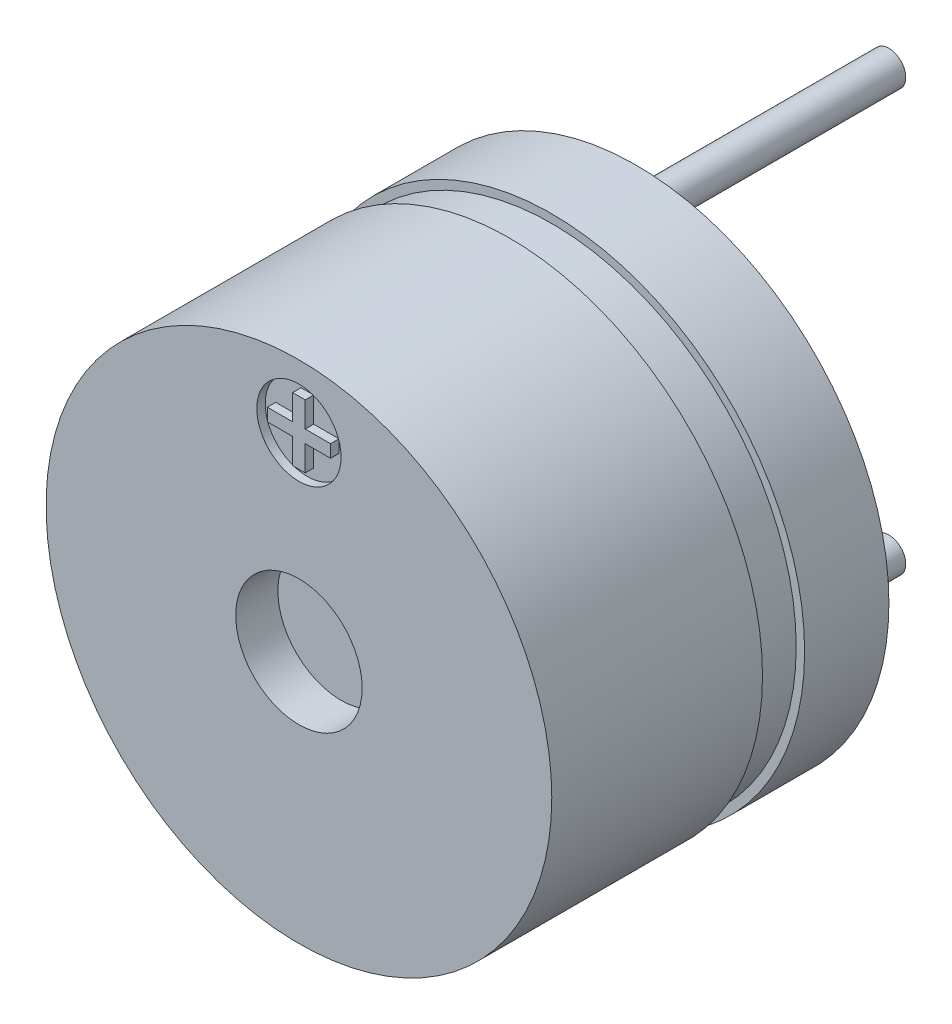
ISO-10303-21;
HEADER;
FILE_DESCRIPTION(('STEP AP214'),'2;1');
FILE_NAME('part.step','',(''),(''),'','','');
FILE_SCHEMA(('AUTOMOTIVE_DESIGN { 1 0 10303 214 1 1 1 1 }'));
ENDSEC;
DATA;
#1=APPLICATION_CONTEXT('core data for automotive mechanical design processes');
#2=APPLICATION_PROTOCOL_DEFINITION('international standard','automotive_design',2000,#1);
#3=PRODUCT_CONTEXT('',#1,'mechanical');
#4=PRODUCT('Part','Part','',(#3));
#5=PRODUCT_RELATED_PRODUCT_CATEGORY('part','',(#4));
#6=PRODUCT_DEFINITION_FORMATION('','',#4);
#7=PRODUCT_DEFINITION_CONTEXT('part definition',#1,'design');
#8=PRODUCT_DEFINITION('design','',#6,#7);
#9=PRODUCT_DEFINITION_SHAPE('','',#8);
#10=(LENGTH_UNIT() NAMED_UNIT(*) SI_UNIT(.MILLI.,.METRE.));
#11=(NAMED_UNIT(*) PLANE_ANGLE_UNIT() SI_UNIT($,.RADIAN.));
#12=(NAMED_UNIT(*) SI_UNIT($,.STERADIAN.) SOLID_ANGLE_UNIT());
#13=UNCERTAINTY_MEASURE_WITH_UNIT(LENGTH_MEASURE(1.E-05),#10,'distance_accuracy_value','');
#14=(GEOMETRIC_REPRESENTATION_CONTEXT(3) GLOBAL_UNCERTAINTY_ASSIGNED_CONTEXT((#13)) GLOBAL_UNIT_ASSIGNED_CONTEXT((#10,
#11,#12)) REPRESENTATION_CONTEXT('',''));
#15=CARTESIAN_POINT('',(0.,0.,0.));
#16=DIRECTION('',(0.,0.,1.));
#17=DIRECTION('',(1.,0.,0.));
#18=AXIS2_PLACEMENT_3D('',#15,#16,#17);
#19=CARTESIAN_POINT('',(0.,0.,0.));
#20=DIRECTION('',(0.,0.,-1.));
#21=DIRECTION('',(0.,-1.,0.));
#22=AXIS2_PLACEMENT_3D('',#19,#20,#21);
#23=PLANE('',#22);
#24=CARTESIAN_POINT('',(0.,0.,0.));
#25=DIRECTION('',(0.,0.,-1.));
#26=DIRECTION('',(1.,0.,0.));
#27=AXIS2_PLACEMENT_3D('',#24,#25,#26);
#28=CIRCLE('',#27,6.);
#29=CARTESIAN_POINT('',(6.,0.,0.));
#30=VERTEX_POINT('',#29);
#31=EDGE_CURVE('P0_E26',#30,#30,#28,.T.);
#32=ORIENTED_EDGE('',*,*,#31,.T.);
#33=EDGE_LOOP('',(#32));
#34=FACE_BOUND('',#33,.T.);
#35=ADVANCED_FACE('P0_F17',(#34),#23,.T.);
#36=CARTESIAN_POINT('',(0.,0.,1.));
#37=DIRECTION('',(0.,0.,-1.));
#38=DIRECTION('',(-1.,0.,0.));
#39=AXIS2_PLACEMENT_3D('',#36,#37,#38);
#40=CYLINDRICAL_SURFACE('',#39,6.);
#41=ORIENTED_EDGE('',*,*,#31,.F.);
#42=DIRECTION('',(0.,0.,1.));
#43=VECTOR('',#42,1.);
#44=CARTESIAN_POINT('',(6.,0.,1.));
#45=LINE('',#44,#43);
#46=CARTESIAN_POINT('',(6.,0.,2.));
#47=VERTEX_POINT('',#46);
#48=EDGE_CURVE('P0_E11',#30,#47,#45,.T.);
#49=ORIENTED_EDGE('',*,*,#48,.T.);
#50=CARTESIAN_POINT('',(0.,0.,2.));
#51=DIRECTION('',(0.,0.,-1.));
#52=DIRECTION('',(1.,0.,0.));
#53=AXIS2_PLACEMENT_3D('',#50,#51,#52);
#54=CIRCLE('',#53,6.);
#55=EDGE_CURVE('P0_E108',#47,#47,#54,.T.);
#56=ORIENTED_EDGE('',*,*,#55,.T.);
#57=ORIENTED_EDGE('',*,*,#48,.F.);
#58=EDGE_LOOP('',(#41,#49,#56,#57));
#59=FACE_BOUND('',#58,.T.);
#60=ADVANCED_FACE('P0_F126',(#59),#40,.T.);
#61=CARTESIAN_POINT('',(-6.,0.,2.));
#62=DIRECTION('',(0.,0.,1.));
#63=DIRECTION('',(1.,0.,0.));
#64=AXIS2_PLACEMENT_3D('',#61,#62,#63);
#65=PLANE('',#64);
#66=CARTESIAN_POINT('',(0.,0.,2.));
#67=DIRECTION('',(0.,0.,-1.));
#68=DIRECTION('',(1.,0.,0.));
#69=AXIS2_PLACEMENT_3D('',#66,#67,#68);
#70=CIRCLE('',#69,5.8);
#71=CARTESIAN_POINT('',(5.8,0.,2.));
#72=VERTEX_POINT('',#71);
#73=EDGE_CURVE('P0_E104',#72,#72,#70,.T.);
#74=ORIENTED_EDGE('',*,*,#73,.T.);
#75=EDGE_LOOP('',(#74));
#76=FACE_BOUND('',#75,.T.);
#77=ORIENTED_EDGE('',*,*,#55,.F.);
#78=EDGE_LOOP('',(#77));
#79=FACE_BOUND('',#78,.T.);
#80=ADVANCED_FACE('P0_F111',(#76,#79),#65,.T.);
#81=CARTESIAN_POINT('',(0.,0.,2.5));
#82=DIRECTION('',(0.,0.,-1.));
#83=DIRECTION('',(-1.,0.,0.));
#84=AXIS2_PLACEMENT_3D('',#81,#82,#83);
#85=CYLINDRICAL_SURFACE('',#84,5.8);
#86=ORIENTED_EDGE('',*,*,#73,.F.);
#87=DIRECTION('',(0.,0.,1.));
#88=VECTOR('',#87,1.);
#89=CARTESIAN_POINT('',(5.8,0.,2.5));
#90=LINE('',#89,#88);
#91=CARTESIAN_POINT('',(5.8,0.,3.));
#92=VERTEX_POINT('',#91);
#93=EDGE_CURVE('P0_E101',#72,#92,#90,.T.);
#94=ORIENTED_EDGE('',*,*,#93,.T.);
#95=CARTESIAN_POINT('',(0.,0.,3.));
#96=DIRECTION('',(0.,0.,-1.));
#97=DIRECTION('',(1.,0.,0.));
#98=AXIS2_PLACEMENT_3D('',#95,#96,#97);
#99=CIRCLE('',#98,5.8);
#100=EDGE_CURVE('P0_E106',#92,#92,#99,.T.);
#101=ORIENTED_EDGE('',*,*,#100,.T.);
#102=ORIENTED_EDGE('',*,*,#93,.F.);
#103=EDGE_LOOP('',(#86,#94,#101,#102));
#104=FACE_BOUND('',#103,.T.);
#105=ADVANCED_FACE('P0_F103',(#104),#85,.T.);
#106=CARTESIAN_POINT('',(-5.8,0.,3.));
#107=DIRECTION('',(0.,0.,-1.));
#108=DIRECTION('',(0.,-1.,0.));
#109=AXIS2_PLACEMENT_3D('',#106,#107,#108);
#110=PLANE('',#109);
#111=ORIENTED_EDGE('',*,*,#100,.F.);
#112=EDGE_LOOP('',(#111));
#113=FACE_BOUND('',#112,.T.);
#114=CARTESIAN_POINT('',(0.,0.,3.));
#115=DIRECTION('',(0.,0.,-1.));
#116=DIRECTION('',(1.,0.,0.));
#117=AXIS2_PLACEMENT_3D('',#114,#115,#116);
#118=CIRCLE('',#117,6.);
#119=CARTESIAN_POINT('',(6.,0.,3.));
#120=VERTEX_POINT('',#119);
#121=EDGE_CURVE('P0_E415',#120,#120,#118,.T.);
#122=ORIENTED_EDGE('',*,*,#121,.T.);
#123=EDGE_LOOP('',(#122));
#124=FACE_BOUND('',#123,.T.);
#125=ADVANCED_FACE('P0_F135',(#113,#124),#110,.T.);
#126=CARTESIAN_POINT('',(0.,0.,5.5));
#127=DIRECTION('',(0.,0.,-1.));
#128=DIRECTION('',(-1.,0.,0.));
#129=AXIS2_PLACEMENT_3D('',#126,#127,#128);
#130=CYLINDRICAL_SURFACE('',#129,6.);
#131=ORIENTED_EDGE('',*,*,#121,.F.);
#132=DIRECTION('',(0.,0.,1.));
#133=VECTOR('',#132,1.);
#134=CARTESIAN_POINT('',(6.,0.,5.5));
#135=LINE('',#134,#133);
#136=CARTESIAN_POINT('',(6.,0.,8.));
#137=VERTEX_POINT('',#136);
#138=EDGE_CURVE('P0_E118',#120,#137,#135,.T.);
#139=ORIENTED_EDGE('',*,*,#138,.T.);
#140=CARTESIAN_POINT('',(0.,0.,8.));
#141=DIRECTION('',(0.,0.,-1.));
#142=DIRECTION('',(1.,0.,0.));
#143=AXIS2_PLACEMENT_3D('',#140,#141,#142);
#144=CIRCLE('',#143,6.);
#145=EDGE_CURVE('P0_E449',#137,#137,#144,.T.);
#146=ORIENTED_EDGE('',*,*,#145,.T.);
#147=ORIENTED_EDGE('',*,*,#138,.F.);
#148=EDGE_LOOP('',(#131,#139,#146,#147));
#149=FACE_BOUND('',#148,.T.);
#150=ADVANCED_FACE('P0_F173',(#149),#130,.T.);
#151=CARTESIAN_POINT('',(-6.,0.,8.));
#152=DIRECTION('',(0.,0.,1.));
#153=DIRECTION('',(1.,0.,0.));
#154=AXIS2_PLACEMENT_3D('',#151,#152,#153);
#155=PLANE('',#154);
#156=DIRECTION('',(0.,1.,0.));
#157=VECTOR('',#156,1.);
#158=CARTESIAN_POINT('',(0.75,2.175,8.));
#159=LINE('',#158,#157);
#160=CARTESIAN_POINT('',(0.75,4.35,8.));
#161=VERTEX_POINT('',#160);
#162=CARTESIAN_POINT('',(0.75,4.65,8.));
#163=VERTEX_POINT('',#162);
#164=EDGE_CURVE('P0_E746',#161,#163,#159,.T.);
#165=ORIENTED_EDGE('',*,*,#164,.T.);
#166=DIRECTION('',(-1.,0.,0.));
#167=VECTOR('',#166,1.);
#168=CARTESIAN_POINT('',(-2.625,4.65,8.));
#169=LINE('',#168,#167);
#170=CARTESIAN_POINT('',(0.15,4.65,8.));
#171=VERTEX_POINT('',#170);
#172=EDGE_CURVE('P0_E471',#163,#171,#169,.T.);
#173=ORIENTED_EDGE('',*,*,#172,.T.);
#174=DIRECTION('',(0.,1.,0.));
#175=VECTOR('',#174,1.);
#176=CARTESIAN_POINT('',(0.15,2.325,8.));
#177=LINE('',#176,#175);
#178=CARTESIAN_POINT('',(0.15,5.25,8.));
#179=VERTEX_POINT('',#178);
#180=EDGE_CURVE('P0_E491',#171,#179,#177,.T.);
#181=ORIENTED_EDGE('',*,*,#180,.T.);
#182=DIRECTION('',(-1.,0.,0.));
#183=VECTOR('',#182,1.);
#184=CARTESIAN_POINT('',(-2.925,5.25,8.));
#185=LINE('',#184,#183);
#186=CARTESIAN_POINT('',(-0.15,5.25,8.));
#187=VERTEX_POINT('',#186);
#188=EDGE_CURVE('P0_E513',#179,#187,#185,.T.);
#189=ORIENTED_EDGE('',*,*,#188,.T.);
#190=DIRECTION('',(0.,-1.,0.));
#191=VECTOR('',#190,1.);
#192=CARTESIAN_POINT('',(-0.15,2.625,8.));
#193=LINE('',#192,#191);
#194=CARTESIAN_POINT('',(-0.15,4.65,8.));
#195=VERTEX_POINT('',#194);
#196=EDGE_CURVE('P0_E537',#187,#195,#193,.T.);
#197=ORIENTED_EDGE('',*,*,#196,.T.);
#198=DIRECTION('',(-1.,0.,0.));
#199=VECTOR('',#198,1.);
#200=CARTESIAN_POINT('',(-3.075,4.65,8.));
#201=LINE('',#200,#199);
#202=CARTESIAN_POINT('',(-0.75,4.65,8.));
#203=VERTEX_POINT('',#202);
#204=EDGE_CURVE('P0_E559',#195,#203,#201,.T.);
#205=ORIENTED_EDGE('',*,*,#204,.T.);
#206=DIRECTION('',(0.,-1.,0.));
#207=VECTOR('',#206,1.);
#208=CARTESIAN_POINT('',(-0.75,2.325,8.));
#209=LINE('',#208,#207);
#210=CARTESIAN_POINT('',(-0.75,4.35,8.));
#211=VERTEX_POINT('',#210);
#212=EDGE_CURVE('P0_E583',#203,#211,#209,.T.);
#213=ORIENTED_EDGE('',*,*,#212,.T.);
#214=DIRECTION('',(1.,0.,0.));
#215=VECTOR('',#214,1.);
#216=CARTESIAN_POINT('',(-3.375,4.35,8.));
#217=LINE('',#216,#215);
#218=CARTESIAN_POINT('',(-0.15,4.35,8.));
#219=VERTEX_POINT('',#218);
#220=EDGE_CURVE('P0_E608',#211,#219,#217,.T.);
#221=ORIENTED_EDGE('',*,*,#220,.T.);
#222=DIRECTION('',(0.,-1.,0.));
#223=VECTOR('',#222,1.);
#224=CARTESIAN_POINT('',(-0.15,2.175,8.));
#225=LINE('',#224,#223);
#226=CARTESIAN_POINT('',(-0.15,3.75,8.));
#227=VERTEX_POINT('',#226);
#228=EDGE_CURVE('P0_E646',#219,#227,#225,.T.);
#229=ORIENTED_EDGE('',*,*,#228,.T.);
#230=DIRECTION('',(1.,0.,0.));
#231=VECTOR('',#230,1.);
#232=CARTESIAN_POINT('',(-3.075,3.75,8.));
#233=LINE('',#232,#231);
#234=CARTESIAN_POINT('',(0.15,3.75,8.));
#235=VERTEX_POINT('',#234);
#236=EDGE_CURVE('P0_E625',#227,#235,#233,.T.);
#237=ORIENTED_EDGE('',*,*,#236,.T.);
#238=DIRECTION('',(0.,1.,0.));
#239=VECTOR('',#238,1.);
#240=CARTESIAN_POINT('',(0.15,1.875,8.));
#241=LINE('',#240,#239);
#242=CARTESIAN_POINT('',(0.15,4.35,8.));
#243=VERTEX_POINT('',#242);
#244=EDGE_CURVE('P0_E666',#235,#243,#241,.T.);
#245=ORIENTED_EDGE('',*,*,#244,.T.);
#246=DIRECTION('',(1.,0.,0.));
#247=VECTOR('',#246,1.);
#248=CARTESIAN_POINT('',(-2.925,4.35,8.));
#249=LINE('',#248,#247);
#250=EDGE_CURVE('P0_E708',#243,#161,#249,.T.);
#251=ORIENTED_EDGE('',*,*,#250,.T.);
#252=EDGE_LOOP('',(#165,#173,#181,#189,#197,#205,#213,#221,#229,#237,#245,#251));
#253=FACE_BOUND('',#252,.T.);
#254=ADVANCED_FACE('P0_F184',(#253),#155,.T.);
#255=CARTESIAN_POINT('',(0.,0.,7.));
#256=DIRECTION('',(0.,0.,1.));
#257=DIRECTION('',(1.,0.,0.));
#258=AXIS2_PLACEMENT_3D('',#255,#256,#257);
#259=PLANE('',#258);
#260=CARTESIAN_POINT('',(0.,0.,7.));
#261=DIRECTION('',(0.,0.,-1.));
#262=DIRECTION('',(-1.,0.,0.));
#263=AXIS2_PLACEMENT_3D('',#260,#261,#262);
#264=CIRCLE('',#263,1.5);
#265=CARTESIAN_POINT('',(1.5,0.,7.));
#266=VERTEX_POINT('',#265);
#267=EDGE_CURVE('P0_E421',#266,#266,#264,.T.);
#268=ORIENTED_EDGE('',*,*,#267,.F.);
#269=EDGE_LOOP('',(#268));
#270=FACE_BOUND('',#269,.T.);
#271=ADVANCED_FACE('P0_F195',(#270),#259,.T.);
#272=CARTESIAN_POINT('',(0.,0.,8.));
#273=DIRECTION('',(0.,0.,-1.));
#274=DIRECTION('',(-1.,0.,0.));
#275=AXIS2_PLACEMENT_3D('',#272,#273,#274);
#276=CYLINDRICAL_SURFACE('',#275,1.5);
#277=CARTESIAN_POINT('',(0.,0.,8.));
#278=DIRECTION('',(0.,0.,-1.));
#279=DIRECTION('',(-1.,0.,0.));
#280=AXIS2_PLACEMENT_3D('',#277,#278,#279);
#281=CIRCLE('',#280,1.5);
#282=CARTESIAN_POINT('',(1.5,0.,8.));
#283=VERTEX_POINT('',#282);
#284=EDGE_CURVE('P0_E440',#283,#283,#281,.T.);
#285=ORIENTED_EDGE('',*,*,#284,.F.);
#286=DIRECTION('',(0.,0.,-1.));
#287=VECTOR('',#286,1.);
#288=CARTESIAN_POINT('',(1.5,0.,8.));
#289=LINE('',#288,#287);
#290=EDGE_CURVE('P0_E432',#283,#266,#289,.T.);
#291=ORIENTED_EDGE('',*,*,#290,.T.);
#292=ORIENTED_EDGE('',*,*,#267,.T.);
#293=ORIENTED_EDGE('',*,*,#290,.F.);
#294=EDGE_LOOP('',(#285,#291,#292,#293));
#295=FACE_BOUND('',#294,.T.);
#296=ADVANCED_FACE('P0_F206',(#295),#276,.F.);
#297=CARTESIAN_POINT('',(-6.,0.,8.));
#298=DIRECTION('',(0.,0.,1.));
#299=DIRECTION('',(1.,0.,0.));
#300=AXIS2_PLACEMENT_3D('',#297,#298,#299);
#301=PLANE('',#300);
#302=CARTESIAN_POINT('',(0.,4.5,8.));
#303=DIRECTION('',(0.,0.,-1.));
#304=DIRECTION('',(-1.,0.,0.));
#305=AXIS2_PLACEMENT_3D('',#302,#303,#304);
#306=CIRCLE('',#305,1.);
#307=CARTESIAN_POINT('',(1.,4.5,8.));
#308=VERTEX_POINT('',#307);
#309=EDGE_CURVE('P0_E459',#308,#308,#306,.T.);
#310=ORIENTED_EDGE('',*,*,#309,.T.);
#311=EDGE_LOOP('',(#310));
#312=FACE_BOUND('',#311,.T.);
#313=ORIENTED_EDGE('',*,*,#284,.T.);
#314=EDGE_LOOP('',(#313));
#315=FACE_BOUND('',#314,.T.);
#316=ORIENTED_EDGE('',*,*,#145,.F.);
#317=EDGE_LOOP('',(#316));
#318=FACE_BOUND('',#317,.T.);
#319=ADVANCED_FACE('P0_F218',(#312,#315,#318),#301,.T.);
#320=CARTESIAN_POINT('',(0.,4.5,7.8));
#321=DIRECTION('',(0.,0.,1.));
#322=DIRECTION('',(1.,0.,0.));
#323=AXIS2_PLACEMENT_3D('',#320,#321,#322);
#324=PLANE('',#323);
#325=DIRECTION('',(-1.,0.,0.));
#326=VECTOR('',#325,1.);
#327=CARTESIAN_POINT('',(-0.75,4.65,7.8));
#328=LINE('',#327,#326);
#329=CARTESIAN_POINT('',(0.75,4.65,7.8));
#330=VERTEX_POINT('',#329);
#331=CARTESIAN_POINT('',(0.15,4.65,7.8));
#332=VERTEX_POINT('',#331);
#333=EDGE_CURVE('P0_E467',#330,#332,#328,.T.);
#334=ORIENTED_EDGE('',*,*,#333,.F.);
#335=DIRECTION('',(0.,1.,0.));
#336=VECTOR('',#335,1.);
#337=CARTESIAN_POINT('',(0.75,4.65,7.8));
#338=LINE('',#337,#336);
#339=CARTESIAN_POINT('',(0.75,4.35,7.8));
#340=VERTEX_POINT('',#339);
#341=EDGE_CURVE('P0_E730',#340,#330,#338,.T.);
#342=ORIENTED_EDGE('',*,*,#341,.F.);
#343=DIRECTION('',(1.,0.,0.));
#344=VECTOR('',#343,1.);
#345=CARTESIAN_POINT('',(0.75,4.35,7.8));
#346=LINE('',#345,#344);
#347=CARTESIAN_POINT('',(0.15,4.35,7.8));
#348=VERTEX_POINT('',#347);
#349=EDGE_CURVE('P0_E680',#348,#340,#346,.T.);
#350=ORIENTED_EDGE('',*,*,#349,.F.);
#351=DIRECTION('',(0.,1.,0.));
#352=VECTOR('',#351,1.);
#353=CARTESIAN_POINT('',(0.15,5.25,7.8));
#354=LINE('',#353,#352);
#355=CARTESIAN_POINT('',(0.15,3.75,7.8));
#356=VERTEX_POINT('',#355);
#357=EDGE_CURVE('P0_E630',#356,#348,#354,.T.);
#358=ORIENTED_EDGE('',*,*,#357,.F.);
#359=DIRECTION('',(1.,0.,0.));
#360=VECTOR('',#359,1.);
#361=CARTESIAN_POINT('',(0.15,3.75,7.8));
#362=LINE('',#361,#360);
#363=CARTESIAN_POINT('',(-0.15,3.75,7.8));
#364=VERTEX_POINT('',#363);
#365=EDGE_CURVE('P0_E624',#364,#356,#362,.T.);
#366=ORIENTED_EDGE('',*,*,#365,.F.);
#367=DIRECTION('',(0.,-1.,0.));
#368=VECTOR('',#367,1.);
#369=CARTESIAN_POINT('',(-0.15,3.75,7.8));
#370=LINE('',#369,#368);
#371=CARTESIAN_POINT('',(-0.15,4.35,7.8));
#372=VERTEX_POINT('',#371);
#373=EDGE_CURVE('P0_E614',#372,#364,#370,.T.);
#374=ORIENTED_EDGE('',*,*,#373,.F.);
#375=DIRECTION('',(1.,0.,0.));
#376=VECTOR('',#375,1.);
#377=CARTESIAN_POINT('',(0.75,4.35,7.8));
#378=LINE('',#377,#376);
#379=CARTESIAN_POINT('',(-0.75,4.35,7.8));
#380=VERTEX_POINT('',#379);
#381=EDGE_CURVE('P0_E591',#380,#372,#378,.T.);
#382=ORIENTED_EDGE('',*,*,#381,.F.);
#383=DIRECTION('',(0.,-1.,0.));
#384=VECTOR('',#383,1.);
#385=CARTESIAN_POINT('',(-0.75,4.35,7.8));
#386=LINE('',#385,#384);
#387=CARTESIAN_POINT('',(-0.75,4.65,7.8));
#388=VERTEX_POINT('',#387);
#389=EDGE_CURVE('P0_E567',#388,#380,#386,.T.);
#390=ORIENTED_EDGE('',*,*,#389,.F.);
#391=DIRECTION('',(-1.,0.,0.));
#392=VECTOR('',#391,1.);
#393=CARTESIAN_POINT('',(-0.75,4.65,7.8));
#394=LINE('',#393,#392);
#395=CARTESIAN_POINT('',(-0.15,4.65,7.8));
#396=VERTEX_POINT('',#395);
#397=EDGE_CURVE('P0_E543',#396,#388,#394,.T.);
#398=ORIENTED_EDGE('',*,*,#397,.F.);
#399=DIRECTION('',(0.,-1.,0.));
#400=VECTOR('',#399,1.);
#401=CARTESIAN_POINT('',(-0.15,3.75,7.8));
#402=LINE('',#401,#400);
#403=CARTESIAN_POINT('',(-0.15,5.25,7.8));
#404=VERTEX_POINT('',#403);
#405=EDGE_CURVE('P0_E520',#404,#396,#402,.T.);
#406=ORIENTED_EDGE('',*,*,#405,.F.);
#407=DIRECTION('',(-1.,0.,0.));
#408=VECTOR('',#407,1.);
#409=CARTESIAN_POINT('',(-0.15,5.25,7.8));
#410=LINE('',#409,#408);
#411=CARTESIAN_POINT('',(0.15,5.25,7.8));
#412=VERTEX_POINT('',#411);
#413=EDGE_CURVE('P0_E498',#412,#404,#410,.T.);
#414=ORIENTED_EDGE('',*,*,#413,.F.);
#415=DIRECTION('',(0.,1.,0.));
#416=VECTOR('',#415,1.);
#417=CARTESIAN_POINT('',(0.15,5.25,7.8));
#418=LINE('',#417,#416);
#419=EDGE_CURVE('P0_E476',#332,#412,#418,.T.);
#420=ORIENTED_EDGE('',*,*,#419,.F.);
#421=EDGE_LOOP('',(#334,#342,#350,#358,#366,#374,#382,#390,#398,#406,#414,#420));
#422=FACE_BOUND('',#421,.T.);
#423=CARTESIAN_POINT('',(0.,4.5,7.8));
#424=DIRECTION('',(0.,0.,-1.));
#425=DIRECTION('',(-1.,0.,0.));
#426=AXIS2_PLACEMENT_3D('',#423,#424,#425);
#427=CIRCLE('',#426,1.);
#428=CARTESIAN_POINT('',(1.,4.5,7.8));
#429=VERTEX_POINT('',#428);
#430=EDGE_CURVE('P0_E444',#429,#429,#427,.T.);
#431=ORIENTED_EDGE('',*,*,#430,.F.);
#432=EDGE_LOOP('',(#431));
#433=FACE_BOUND('',#432,.T.);
#434=ADVANCED_FACE('P0_F231',(#422,#433),#324,.T.);
#435=CARTESIAN_POINT('',(0.,4.5,8.));
#436=DIRECTION('',(0.,0.,-1.));
#437=DIRECTION('',(-1.,0.,0.));
#438=AXIS2_PLACEMENT_3D('',#435,#436,#437);
#439=CYLINDRICAL_SURFACE('',#438,1.);
#440=ORIENTED_EDGE('',*,*,#309,.F.);
#441=DIRECTION('',(0.,0.,-1.));
#442=VECTOR('',#441,1.);
#443=CARTESIAN_POINT('',(1.,4.5,8.));
#444=LINE('',#443,#442);
#445=EDGE_CURVE('P0_E450',#308,#429,#444,.T.);
#446=ORIENTED_EDGE('',*,*,#445,.T.);
#447=ORIENTED_EDGE('',*,*,#430,.T.);
#448=ORIENTED_EDGE('',*,*,#445,.F.);
#449=EDGE_LOOP('',(#440,#446,#447,#448));
#450=FACE_BOUND('',#449,.T.);
#451=ADVANCED_FACE('P0_F242',(#450),#439,.F.);
#452=CARTESIAN_POINT('',(0.75,4.65,8.));
#453=DIRECTION('',(0.,-1.,0.));
#454=DIRECTION('',(0.,0.,-1.));
#455=AXIS2_PLACEMENT_3D('',#452,#453,#454);
#456=PLANE('',#455);
#457=ORIENTED_EDGE('',*,*,#172,.F.);
#458=DIRECTION('',(0.,0.,-1.));
#459=VECTOR('',#458,1.);
#460=CARTESIAN_POINT('',(0.75,4.65,8.));
#461=LINE('',#460,#459);
#462=EDGE_CURVE('P0_E724',#163,#330,#461,.T.);
#463=ORIENTED_EDGE('',*,*,#462,.T.);
#464=ORIENTED_EDGE('',*,*,#333,.T.);
#465=DIRECTION('',(0.,0.,-1.));
#466=VECTOR('',#465,1.);
#467=CARTESIAN_POINT('',(0.15,4.65,8.));
#468=LINE('',#467,#466);
#469=EDGE_CURVE('P0_E483',#171,#332,#468,.T.);
#470=ORIENTED_EDGE('',*,*,#469,.F.);
#471=EDGE_LOOP('',(#457,#463,#464,#470));
#472=FACE_BOUND('',#471,.T.);
#473=ADVANCED_FACE('P0_F253',(#472),#456,.F.);
#474=CARTESIAN_POINT('',(0.15,4.65,8.));
#475=DIRECTION('',(-1.,0.,0.));
#476=DIRECTION('',(0.,0.,1.));
#477=AXIS2_PLACEMENT_3D('',#474,#475,#476);
#478=PLANE('',#477);
#479=ORIENTED_EDGE('',*,*,#180,.F.);
#480=ORIENTED_EDGE('',*,*,#469,.T.);
#481=ORIENTED_EDGE('',*,*,#419,.T.);
#482=DIRECTION('',(0.,0.,-1.));
#483=VECTOR('',#482,1.);
#484=CARTESIAN_POINT('',(0.15,5.25,8.));
#485=LINE('',#484,#483);
#486=EDGE_CURVE('P0_E505',#179,#412,#485,.T.);
#487=ORIENTED_EDGE('',*,*,#486,.F.);
#488=EDGE_LOOP('',(#479,#480,#481,#487));
#489=FACE_BOUND('',#488,.T.);
#490=ADVANCED_FACE('P0_F265',(#489),#478,.F.);
#491=CARTESIAN_POINT('',(0.15,5.25,8.));
#492=DIRECTION('',(0.,-1.,0.));
#493=DIRECTION('',(0.,0.,-1.));
#494=AXIS2_PLACEMENT_3D('',#491,#492,#493);
#495=PLANE('',#494);
#496=ORIENTED_EDGE('',*,*,#188,.F.);
#497=ORIENTED_EDGE('',*,*,#486,.T.);
#498=ORIENTED_EDGE('',*,*,#413,.T.);
#499=DIRECTION('',(0.,0.,-1.));
#500=VECTOR('',#499,1.);
#501=CARTESIAN_POINT('',(-0.15,5.25,8.));
#502=LINE('',#501,#500);
#503=EDGE_CURVE('P0_E533',#187,#404,#502,.T.);
#504=ORIENTED_EDGE('',*,*,#503,.F.);
#505=EDGE_LOOP('',(#496,#497,#498,#504));
#506=FACE_BOUND('',#505,.T.);
#507=ADVANCED_FACE('P0_F276',(#506),#495,.F.);
#508=CARTESIAN_POINT('',(-0.15,5.25,8.));
#509=DIRECTION('',(1.,0.,0.));
#510=DIRECTION('',(0.,1.,0.));
#511=AXIS2_PLACEMENT_3D('',#508,#509,#510);
#512=PLANE('',#511);
#513=ORIENTED_EDGE('',*,*,#196,.F.);
#514=ORIENTED_EDGE('',*,*,#503,.T.);
#515=ORIENTED_EDGE('',*,*,#405,.T.);
#516=DIRECTION('',(0.,0.,-1.));
#517=VECTOR('',#516,1.);
#518=CARTESIAN_POINT('',(-0.15,4.65,8.));
#519=LINE('',#518,#517);
#520=EDGE_CURVE('P0_E551',#195,#396,#519,.T.);
#521=ORIENTED_EDGE('',*,*,#520,.F.);
#522=EDGE_LOOP('',(#513,#514,#515,#521));
#523=FACE_BOUND('',#522,.T.);
#524=ADVANCED_FACE('P0_F287',(#523),#512,.F.);
#525=CARTESIAN_POINT('',(-0.15,4.65,8.));
#526=DIRECTION('',(0.,-1.,0.));
#527=DIRECTION('',(0.,0.,-1.));
#528=AXIS2_PLACEMENT_3D('',#525,#526,#527);
#529=PLANE('',#528);
#530=ORIENTED_EDGE('',*,*,#204,.F.);
#531=ORIENTED_EDGE('',*,*,#520,.T.);
#532=ORIENTED_EDGE('',*,*,#397,.T.);
#533=DIRECTION('',(0.,0.,-1.));
#534=VECTOR('',#533,1.);
#535=CARTESIAN_POINT('',(-0.75,4.65,8.));
#536=LINE('',#535,#534);
#537=EDGE_CURVE('P0_E575',#203,#388,#536,.T.);
#538=ORIENTED_EDGE('',*,*,#537,.F.);
#539=EDGE_LOOP('',(#530,#531,#532,#538));
#540=FACE_BOUND('',#539,.T.);
#541=ADVANCED_FACE('P0_F298',(#540),#529,.F.);
#542=CARTESIAN_POINT('',(-0.75,4.65,8.));
#543=DIRECTION('',(1.,0.,0.));
#544=DIRECTION('',(0.,1.,0.));
#545=AXIS2_PLACEMENT_3D('',#542,#543,#544);
#546=PLANE('',#545);
#547=ORIENTED_EDGE('',*,*,#212,.F.);
#548=ORIENTED_EDGE('',*,*,#537,.T.);
#549=ORIENTED_EDGE('',*,*,#389,.T.);
#550=DIRECTION('',(0.,0.,-1.));
#551=VECTOR('',#550,1.);
#552=CARTESIAN_POINT('',(-0.75,4.35,8.));
#553=LINE('',#552,#551);
#554=EDGE_CURVE('P0_E599',#211,#380,#553,.T.);
#555=ORIENTED_EDGE('',*,*,#554,.F.);
#556=EDGE_LOOP('',(#547,#548,#549,#555));
#557=FACE_BOUND('',#556,.T.);
#558=ADVANCED_FACE('P0_F309',(#557),#546,.F.);
#559=CARTESIAN_POINT('',(-0.75,4.35,8.));
#560=DIRECTION('',(0.,1.,0.));
#561=DIRECTION('',(1.,0.,0.));
#562=AXIS2_PLACEMENT_3D('',#559,#560,#561);
#563=PLANE('',#562);
#564=ORIENTED_EDGE('',*,*,#220,.F.);
#565=ORIENTED_EDGE('',*,*,#554,.T.);
#566=ORIENTED_EDGE('',*,*,#381,.T.);
#567=DIRECTION('',(0.,0.,-1.));
#568=VECTOR('',#567,1.);
#569=CARTESIAN_POINT('',(-0.15,4.35,8.));
#570=LINE('',#569,#568);
#571=EDGE_CURVE('P0_E652',#219,#372,#570,.T.);
#572=ORIENTED_EDGE('',*,*,#571,.F.);
#573=EDGE_LOOP('',(#564,#565,#566,#572));
#574=FACE_BOUND('',#573,.T.);
#575=ADVANCED_FACE('P0_F320',(#574),#563,.F.);
#576=CARTESIAN_POINT('',(-0.15,4.35,8.));
#577=DIRECTION('',(1.,0.,0.));
#578=DIRECTION('',(0.,1.,0.));
#579=AXIS2_PLACEMENT_3D('',#576,#577,#578);
#580=PLANE('',#579);
#581=ORIENTED_EDGE('',*,*,#228,.F.);
#582=ORIENTED_EDGE('',*,*,#571,.T.);
#583=ORIENTED_EDGE('',*,*,#373,.T.);
#584=DIRECTION('',(0.,0.,-1.));
#585=VECTOR('',#584,1.);
#586=CARTESIAN_POINT('',(-0.15,3.75,8.));
#587=LINE('',#586,#585);
#588=EDGE_CURVE('P0_E618',#227,#364,#587,.T.);
#589=ORIENTED_EDGE('',*,*,#588,.F.);
#590=EDGE_LOOP('',(#581,#582,#583,#589));
#591=FACE_BOUND('',#590,.T.);
#592=ADVANCED_FACE('P0_F330',(#591),#580,.F.);
#593=CARTESIAN_POINT('',(-0.15,3.75,8.));
#594=DIRECTION('',(0.,1.,0.));
#595=DIRECTION('',(1.,0.,0.));
#596=AXIS2_PLACEMENT_3D('',#593,#594,#595);
#597=PLANE('',#596);
#598=ORIENTED_EDGE('',*,*,#236,.F.);
#599=ORIENTED_EDGE('',*,*,#588,.T.);
#600=ORIENTED_EDGE('',*,*,#365,.T.);
#601=DIRECTION('',(0.,0.,-1.));
#602=VECTOR('',#601,1.);
#603=CARTESIAN_POINT('',(0.15,3.75,8.));
#604=LINE('',#603,#602);
#605=EDGE_CURVE('P0_E636',#235,#356,#604,.T.);
#606=ORIENTED_EDGE('',*,*,#605,.F.);
#607=EDGE_LOOP('',(#598,#599,#600,#606));
#608=FACE_BOUND('',#607,.T.);
#609=ADVANCED_FACE('P0_F340',(#608),#597,.F.);
#610=CARTESIAN_POINT('',(0.15,3.75,8.));
#611=DIRECTION('',(-1.,0.,0.));
#612=DIRECTION('',(0.,0.,1.));
#613=AXIS2_PLACEMENT_3D('',#610,#611,#612);
#614=PLANE('',#613);
#615=ORIENTED_EDGE('',*,*,#244,.F.);
#616=ORIENTED_EDGE('',*,*,#605,.T.);
#617=ORIENTED_EDGE('',*,*,#357,.T.);
#618=DIRECTION('',(0.,0.,-1.));
#619=VECTOR('',#618,1.);
#620=CARTESIAN_POINT('',(0.15,4.35,8.));
#621=LINE('',#620,#619);
#622=EDGE_CURVE('P0_E694',#243,#348,#621,.T.);
#623=ORIENTED_EDGE('',*,*,#622,.F.);
#624=EDGE_LOOP('',(#615,#616,#617,#623));
#625=FACE_BOUND('',#624,.T.);
#626=ADVANCED_FACE('P0_F350',(#625),#614,.F.);
#627=CARTESIAN_POINT('',(0.15,4.35,8.));
#628=DIRECTION('',(0.,1.,0.));
#629=DIRECTION('',(1.,0.,0.));
#630=AXIS2_PLACEMENT_3D('',#627,#628,#629);
#631=PLANE('',#630);
#632=ORIENTED_EDGE('',*,*,#250,.F.);
#633=ORIENTED_EDGE('',*,*,#622,.T.);
#634=ORIENTED_EDGE('',*,*,#349,.T.);
#635=DIRECTION('',(0.,0.,-1.));
#636=VECTOR('',#635,1.);
#637=CARTESIAN_POINT('',(0.75,4.35,8.));
#638=LINE('',#637,#636);
#639=EDGE_CURVE('P0_E738',#161,#340,#638,.T.);
#640=ORIENTED_EDGE('',*,*,#639,.F.);
#641=EDGE_LOOP('',(#632,#633,#634,#640));
#642=FACE_BOUND('',#641,.T.);
#643=ADVANCED_FACE('P0_F360',(#642),#631,.F.);
#644=CARTESIAN_POINT('',(0.75,4.35,8.));
#645=DIRECTION('',(-1.,0.,0.));
#646=DIRECTION('',(0.,0.,1.));
#647=AXIS2_PLACEMENT_3D('',#644,#645,#646);
#648=PLANE('',#647);
#649=ORIENTED_EDGE('',*,*,#164,.F.);
#650=ORIENTED_EDGE('',*,*,#639,.T.);
#651=ORIENTED_EDGE('',*,*,#341,.T.);
#652=ORIENTED_EDGE('',*,*,#462,.F.);
#653=EDGE_LOOP('',(#649,#650,#651,#652));
#654=FACE_BOUND('',#653,.T.);
#655=ADVANCED_FACE('P0_F371',(#654),#648,.F.);
#656=CLOSED_SHELL('',(#35,#60,#80,#105,#125,#150,#254,#271,#296,#319,#434,#451,#473,#490,#507,
#524,#541,#558,#575,#592,#609,#626,#643,#655));
#657=MANIFOLD_SOLID_BREP('P0_B1',#656);
#658=CARTESIAN_POINT('',(0.,-5.,0.));
#659=DIRECTION('',(0.,0.,-1.));
#660=DIRECTION('',(0.,-1.,0.));
#661=AXIS2_PLACEMENT_3D('',#658,#659,#660);
#662=PLANE('',#661);
#663=CARTESIAN_POINT('',(0.,-5.,0.));
#664=DIRECTION('',(0.,0.,-1.));
#665=DIRECTION('',(1.,0.,0.));
#666=AXIS2_PLACEMENT_3D('',#663,#664,#665);
#667=CIRCLE('',#666,0.4);
#668=CARTESIAN_POINT('',(-0.4,-5.,0.));
#669=VERTEX_POINT('',#668);
#670=EDGE_CURVE('P1_E11',#669,#669,#667,.T.);
#671=ORIENTED_EDGE('',*,*,#670,.F.);
#672=EDGE_LOOP('',(#671));
#673=FACE_BOUND('',#672,.T.);
#674=ADVANCED_FACE('P1_F17',(#673),#662,.F.);
#675=CARTESIAN_POINT('',(0.,-5.,-6.));
#676=DIRECTION('',(0.,0.,-1.));
#677=DIRECTION('',(0.,-1.,0.));
#678=AXIS2_PLACEMENT_3D('',#675,#676,#677);
#679=PLANE('',#678);
#680=CARTESIAN_POINT('',(0.,-5.,-6.));
#681=DIRECTION('',(0.,0.,-1.));
#682=DIRECTION('',(1.,0.,0.));
#683=AXIS2_PLACEMENT_3D('',#680,#681,#682);
#684=CIRCLE('',#683,0.4);
#685=CARTESIAN_POINT('',(-0.4,-5.,-6.));
#686=VERTEX_POINT('',#685);
#687=EDGE_CURVE('P1_E42',#686,#686,#684,.T.);
#688=ORIENTED_EDGE('',*,*,#687,.T.);
#689=EDGE_LOOP('',(#688));
#690=FACE_BOUND('',#689,.T.);
#691=ADVANCED_FACE('P1_F19',(#690),#679,.T.);
#692=CARTESIAN_POINT('',(0.,-5.,0.));
#693=DIRECTION('',(0.,0.,-1.));
#694=DIRECTION('',(1.,0.,0.));
#695=AXIS2_PLACEMENT_3D('',#692,#693,#694);
#696=CYLINDRICAL_SURFACE('',#695,0.4);
#697=ORIENTED_EDGE('',*,*,#687,.F.);
#698=DIRECTION('',(0.,0.,1.));
#699=VECTOR('',#698,1.);
#700=CARTESIAN_POINT('',(-0.4,-5.,0.));
#701=LINE('',#700,#699);
#702=EDGE_CURVE('P1_E21',#686,#669,#701,.T.);
#703=ORIENTED_EDGE('',*,*,#702,.T.);
#704=ORIENTED_EDGE('',*,*,#670,.T.);
#705=ORIENTED_EDGE('',*,*,#702,.F.);
#706=EDGE_LOOP('',(#697,#703,#704,#705));
#707=FACE_BOUND('',#706,.T.);
#708=ADVANCED_FACE('P1_F41',(#707),#696,.T.);
#709=CLOSED_SHELL('',(#674,#691,#708));
#710=MANIFOLD_SOLID_BREP('P1_B1',#709);
#711=CARTESIAN_POINT('',(0.,5.,0.));
#712=DIRECTION('',(0.,0.,-1.));
#713=DIRECTION('',(0.,-1.,0.));
#714=AXIS2_PLACEMENT_3D('',#711,#712,#713);
#715=PLANE('',#714);
#716=CARTESIAN_POINT('',(0.,5.,0.));
#717=DIRECTION('',(0.,0.,-1.));
#718=DIRECTION('',(1.,0.,0.));
#719=AXIS2_PLACEMENT_3D('',#716,#717,#718);
#720=CIRCLE('',#719,0.4);
#721=CARTESIAN_POINT('',(-0.4,5.,0.));
#722=VERTEX_POINT('',#721);
#723=EDGE_CURVE('P2_E11',#722,#722,#720,.T.);
#724=ORIENTED_EDGE('',*,*,#723,.F.);
#725=EDGE_LOOP('',(#724));
#726=FACE_BOUND('',#725,.T.);
#727=ADVANCED_FACE('P2_F17',(#726),#715,.F.);
#728=CARTESIAN_POINT('',(0.,5.,-6.));
#729=DIRECTION('',(0.,0.,-1.));
#730=DIRECTION('',(0.,-1.,0.));
#731=AXIS2_PLACEMENT_3D('',#728,#729,#730);
#732=PLANE('',#731);
#733=CARTESIAN_POINT('',(0.,5.,-6.));
#734=DIRECTION('',(0.,0.,-1.));
#735=DIRECTION('',(1.,0.,0.));
#736=AXIS2_PLACEMENT_3D('',#733,#734,#735);
#737=CIRCLE('',#736,0.4);
#738=CARTESIAN_POINT('',(-0.4,5.,-6.));
#739=VERTEX_POINT('',#738);
#740=EDGE_CURVE('P2_E41',#739,#739,#737,.T.);
#741=ORIENTED_EDGE('',*,*,#740,.T.);
#742=EDGE_LOOP('',(#741));
#743=FACE_BOUND('',#742,.T.);
#744=ADVANCED_FACE('P2_F44',(#743),#732,.T.);
#745=CARTESIAN_POINT('',(0.,5.,0.));
#746=DIRECTION('',(0.,0.,-1.));
#747=DIRECTION('',(1.,0.,0.));
#748=AXIS2_PLACEMENT_3D('',#745,#746,#747);
#749=CYLINDRICAL_SURFACE('',#748,0.4);
#750=ORIENTED_EDGE('',*,*,#740,.F.);
#751=DIRECTION('',(0.,0.,1.));
#752=VECTOR('',#751,1.);
#753=CARTESIAN_POINT('',(-0.4,5.,0.));
#754=LINE('',#753,#752);
#755=EDGE_CURVE('P2_E25',#739,#722,#754,.T.);
#756=ORIENTED_EDGE('',*,*,#755,.T.);
#757=ORIENTED_EDGE('',*,*,#723,.T.);
#758=ORIENTED_EDGE('',*,*,#755,.F.);
#759=EDGE_LOOP('',(#750,#756,#757,#758));
#760=FACE_BOUND('',#759,.T.);
#761=ADVANCED_FACE('P2_F40',(#760),#749,.T.);
#762=CLOSED_SHELL('',(#727,#744,#761));
#763=MANIFOLD_SOLID_BREP('P2_B1',#762);
#764=ADVANCED_BREP_SHAPE_REPRESENTATION('',(#18,#657,#710,#763),#14);
#765=SHAPE_DEFINITION_REPRESENTATION(#9,#764);
ENDSEC;
END-ISO-10303-21;
